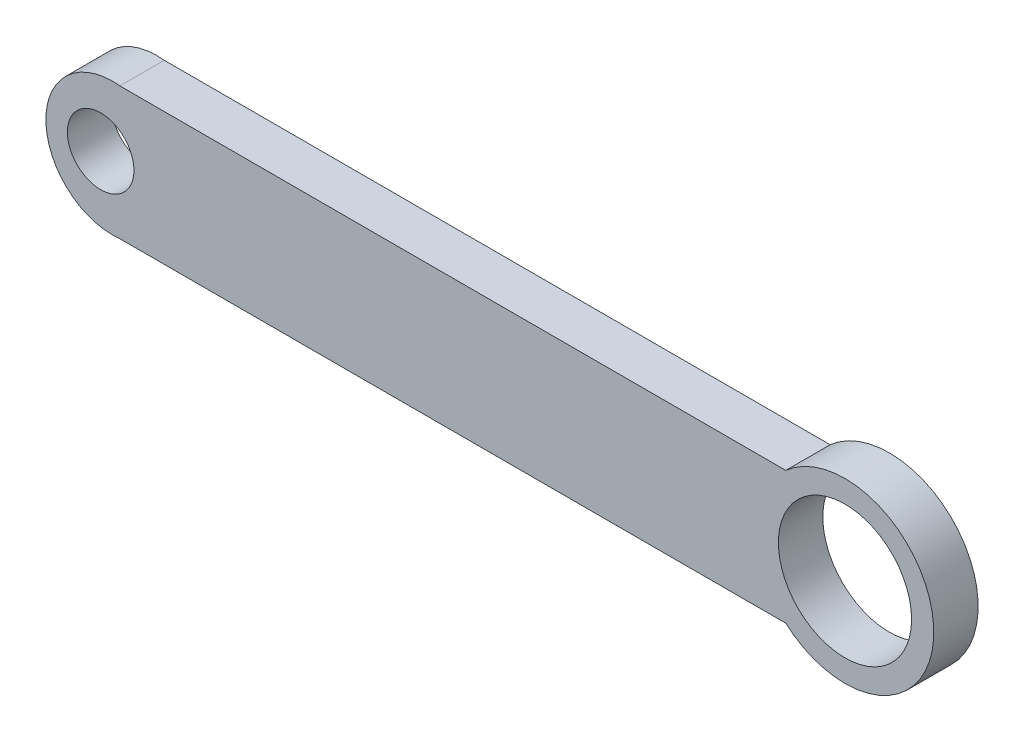
ISO-10303-21;
HEADER;
FILE_DESCRIPTION(('STEP AP214'),'2;1');
FILE_NAME('part.step','',(''),(''),'','','');
FILE_SCHEMA(('AUTOMOTIVE_DESIGN { 1 0 10303 214 1 1 1 1 }'));
ENDSEC;
DATA;
#1=APPLICATION_CONTEXT('core data for automotive mechanical design processes');
#2=APPLICATION_PROTOCOL_DEFINITION('international standard','automotive_design',2000,#1);
#3=PRODUCT_CONTEXT('',#1,'mechanical');
#4=PRODUCT('Part','Part','',(#3));
#5=PRODUCT_RELATED_PRODUCT_CATEGORY('part','',(#4));
#6=PRODUCT_DEFINITION_FORMATION('','',#4);
#7=PRODUCT_DEFINITION_CONTEXT('part definition',#1,'design');
#8=PRODUCT_DEFINITION('design','',#6,#7);
#9=PRODUCT_DEFINITION_SHAPE('','',#8);
#10=(LENGTH_UNIT() NAMED_UNIT(*) SI_UNIT(.MILLI.,.METRE.));
#11=(NAMED_UNIT(*) PLANE_ANGLE_UNIT() SI_UNIT($,.RADIAN.));
#12=(NAMED_UNIT(*) SI_UNIT($,.STERADIAN.) SOLID_ANGLE_UNIT());
#13=UNCERTAINTY_MEASURE_WITH_UNIT(LENGTH_MEASURE(1.E-05),#10,'distance_accuracy_value','');
#14=(GEOMETRIC_REPRESENTATION_CONTEXT(3) GLOBAL_UNCERTAINTY_ASSIGNED_CONTEXT((#13)) GLOBAL_UNIT_ASSIGNED_CONTEXT((#10,
#11,#12)) REPRESENTATION_CONTEXT('',''));
#15=CARTESIAN_POINT('',(0.,0.,0.));
#16=DIRECTION('',(0.,0.,1.));
#17=DIRECTION('',(1.,0.,0.));
#18=AXIS2_PLACEMENT_3D('',#15,#16,#17);
#19=CARTESIAN_POINT('',(20.,0.,2.));
#20=DIRECTION('',(0.,0.,-1.));
#21=DIRECTION('',(1.,0.,0.));
#22=AXIS2_PLACEMENT_3D('',#19,#20,#21);
#23=CYLINDRICAL_SURFACE('',#22,3.);
#24=DIRECTION('',(0.,0.,-1.));
#25=VECTOR('',#24,1.);
#26=CARTESIAN_POINT('',(23.,0.,2.));
#27=LINE('',#26,#25);
#28=CARTESIAN_POINT('',(23.,0.,2.));
#29=VERTEX_POINT('',#28);
#30=CARTESIAN_POINT('',(23.,0.,0.));
#31=VERTEX_POINT('',#30);
#32=EDGE_CURVE('E9',#29,#31,#27,.T.);
#33=ORIENTED_EDGE('',*,*,#32,.F.);
#34=CARTESIAN_POINT('',(20.,0.,2.));
#35=DIRECTION('',(0.,0.,1.));
#36=DIRECTION('',(1.,0.,0.));
#37=AXIS2_PLACEMENT_3D('',#34,#35,#36);
#38=CIRCLE('',#37,3.);
#39=EDGE_CURVE('E119',#29,#29,#38,.T.);
#40=ORIENTED_EDGE('',*,*,#39,.T.);
#41=ORIENTED_EDGE('',*,*,#32,.T.);
#42=CARTESIAN_POINT('',(20.,0.,0.));
#43=DIRECTION('',(0.,0.,-1.));
#44=DIRECTION('',(1.,0.,0.));
#45=AXIS2_PLACEMENT_3D('',#42,#43,#44);
#46=CIRCLE('',#45,3.);
#47=EDGE_CURVE('E112',#31,#31,#46,.T.);
#48=ORIENTED_EDGE('',*,*,#47,.T.);
#49=EDGE_LOOP('',(#33,#40,#41,#48));
#50=FACE_BOUND('',#49,.T.);
#51=ADVANCED_FACE('F14',(#50),#23,.F.);
#52=CARTESIAN_POINT('',(-13.53189,0.,2.));
#53=DIRECTION('',(0.,0.,-1.));
#54=DIRECTION('',(1.,0.,0.));
#55=AXIS2_PLACEMENT_3D('',#52,#53,#54);
#56=CYLINDRICAL_SURFACE('',#55,1.5);
#57=DIRECTION('',(0.,0.,-1.));
#58=VECTOR('',#57,1.);
#59=CARTESIAN_POINT('',(-12.03189,0.,2.));
#60=LINE('',#59,#58);
#61=CARTESIAN_POINT('',(-12.03189,0.,2.));
#62=VERTEX_POINT('',#61);
#63=CARTESIAN_POINT('',(-12.03189,0.,0.));
#64=VERTEX_POINT('',#63);
#65=EDGE_CURVE('E25',#62,#64,#60,.T.);
#66=ORIENTED_EDGE('',*,*,#65,.F.);
#67=CARTESIAN_POINT('',(-13.53189,0.,2.));
#68=DIRECTION('',(0.,0.,1.));
#69=DIRECTION('',(1.,0.,0.));
#70=AXIS2_PLACEMENT_3D('',#67,#68,#69);
#71=CIRCLE('',#70,1.5);
#72=EDGE_CURVE('E116',#62,#62,#71,.T.);
#73=ORIENTED_EDGE('',*,*,#72,.T.);
#74=ORIENTED_EDGE('',*,*,#65,.T.);
#75=CARTESIAN_POINT('',(-13.53189,0.,0.));
#76=DIRECTION('',(0.,0.,-1.));
#77=DIRECTION('',(1.,0.,0.));
#78=AXIS2_PLACEMENT_3D('',#75,#76,#77);
#79=CIRCLE('',#78,1.5);
#80=EDGE_CURVE('E108',#64,#64,#79,.T.);
#81=ORIENTED_EDGE('',*,*,#80,.T.);
#82=EDGE_LOOP('',(#66,#73,#74,#81));
#83=FACE_BOUND('',#82,.T.);
#84=ADVANCED_FACE('F166',(#83),#56,.F.);
#85=CARTESIAN_POINT('',(-13.,0.,0.));
#86=DIRECTION('',(0.,0.,-1.));
#87=DIRECTION('',(1.,0.,0.));
#88=AXIS2_PLACEMENT_3D('',#85,#86,#87);
#89=CYLINDRICAL_SURFACE('',#88,3.);
#90=CARTESIAN_POINT('',(-13.,0.,0.));
#91=DIRECTION('',(0.,0.,1.));
#92=DIRECTION('',(1.,0.,0.));
#93=AXIS2_PLACEMENT_3D('',#90,#91,#92);
#94=CIRCLE('',#93,3.);
#95=CARTESIAN_POINT('',(-12.66666666666,2.98142397,0.));
#96=VERTEX_POINT('',#95);
#97=CARTESIAN_POINT('',(-12.66666666666,-2.98142397,0.));
#98=VERTEX_POINT('',#97);
#99=EDGE_CURVE('E106',#96,#98,#94,.T.);
#100=ORIENTED_EDGE('',*,*,#99,.T.);
#101=DIRECTION('',(0.,0.,1.));
#102=VECTOR('',#101,1.);
#103=CARTESIAN_POINT('',(-12.66666666666,-2.98142397,0.));
#104=LINE('',#103,#102);
#105=CARTESIAN_POINT('',(-12.66666666666,-2.98142397,2.));
#106=VERTEX_POINT('',#105);
#107=EDGE_CURVE('E83',#98,#106,#104,.T.);
#108=ORIENTED_EDGE('',*,*,#107,.T.);
#109=CARTESIAN_POINT('',(-13.,0.,2.));
#110=DIRECTION('',(0.,0.,1.));
#111=DIRECTION('',(1.,0.,0.));
#112=AXIS2_PLACEMENT_3D('',#109,#110,#111);
#113=CIRCLE('',#112,3.);
#114=CARTESIAN_POINT('',(-12.66666666666,2.98142397,2.));
#115=VERTEX_POINT('',#114);
#116=EDGE_CURVE('E113',#115,#106,#113,.T.);
#117=ORIENTED_EDGE('',*,*,#116,.F.);
#118=DIRECTION('',(0.,0.,1.));
#119=VECTOR('',#118,1.);
#120=CARTESIAN_POINT('',(-12.66666666666,2.98142397,0.));
#121=LINE('',#120,#119);
#122=EDGE_CURVE('E124',#96,#115,#121,.T.);
#123=ORIENTED_EDGE('',*,*,#122,.F.);
#124=EDGE_LOOP('',(#100,#108,#117,#123));
#125=FACE_BOUND('',#124,.T.);
#126=ADVANCED_FACE('F148',(#125),#89,.T.);
#127=CARTESIAN_POINT('',(4.066596987969,0.,2.));
#128=DIRECTION('',(0.,0.,1.));
#129=DIRECTION('',(1.,0.,0.));
#130=AXIS2_PLACEMENT_3D('',#127,#128,#129);
#131=PLANE('',#130);
#132=ORIENTED_EDGE('',*,*,#39,.F.);
#133=EDGE_LOOP('',(#132));
#134=FACE_BOUND('',#133,.T.);
#135=ORIENTED_EDGE('',*,*,#72,.F.);
#136=EDGE_LOOP('',(#135));
#137=FACE_BOUND('',#136,.T.);
#138=CARTESIAN_POINT('',(20.,0.,2.));
#139=DIRECTION('',(0.,0.,1.));
#140=DIRECTION('',(1.,0.,0.));
#141=AXIS2_PLACEMENT_3D('',#138,#139,#140);
#142=CIRCLE('',#141,4.);
#143=CARTESIAN_POINT('',(17.333333333333,-2.98142397,2.));
#144=VERTEX_POINT('',#143);
#145=CARTESIAN_POINT('',(17.333333333333,2.98142397,2.));
#146=VERTEX_POINT('',#145);
#147=EDGE_CURVE('E92',#144,#146,#142,.T.);
#148=ORIENTED_EDGE('',*,*,#147,.T.);
#149=DIRECTION('',(1.,0.,0.));
#150=VECTOR('',#149,1.);
#151=CARTESIAN_POINT('',(-12.66666666666,2.98142397,2.));
#152=LINE('',#151,#150);
#153=EDGE_CURVE('E121',#115,#146,#152,.T.);
#154=ORIENTED_EDGE('',*,*,#153,.F.);
#155=ORIENTED_EDGE('',*,*,#116,.T.);
#156=DIRECTION('',(1.,0.,0.));
#157=VECTOR('',#156,1.);
#158=CARTESIAN_POINT('',(-12.66666666666,-2.98142397,2.));
#159=LINE('',#158,#157);
#160=EDGE_CURVE('E18',#106,#144,#159,.T.);
#161=ORIENTED_EDGE('',*,*,#160,.T.);
#162=EDGE_LOOP('',(#148,#154,#155,#161));
#163=FACE_BOUND('',#162,.T.);
#164=ADVANCED_FACE('F141',(#134,#137,#163),#131,.T.);
#165=CARTESIAN_POINT('',(4.066596987969,0.,0.));
#166=DIRECTION('',(0.,0.,1.));
#167=DIRECTION('',(1.,0.,0.));
#168=AXIS2_PLACEMENT_3D('',#165,#166,#167);
#169=PLANE('',#168);
#170=ORIENTED_EDGE('',*,*,#47,.F.);
#171=EDGE_LOOP('',(#170));
#172=FACE_BOUND('',#171,.T.);
#173=ORIENTED_EDGE('',*,*,#80,.F.);
#174=EDGE_LOOP('',(#173));
#175=FACE_BOUND('',#174,.T.);
#176=DIRECTION('',(1.,0.,0.));
#177=VECTOR('',#176,1.);
#178=CARTESIAN_POINT('',(-12.66666666666,-2.98142397,0.));
#179=LINE('',#178,#177);
#180=CARTESIAN_POINT('',(17.333333333333,-2.98142397,0.));
#181=VERTEX_POINT('',#180);
#182=EDGE_CURVE('E76',#98,#181,#179,.T.);
#183=ORIENTED_EDGE('',*,*,#182,.F.);
#184=ORIENTED_EDGE('',*,*,#99,.F.);
#185=DIRECTION('',(1.,0.,0.));
#186=VECTOR('',#185,1.);
#187=CARTESIAN_POINT('',(-12.66666666666,2.98142397,0.));
#188=LINE('',#187,#186);
#189=CARTESIAN_POINT('',(17.333333333333,2.98142397,0.));
#190=VERTEX_POINT('',#189);
#191=EDGE_CURVE('E67',#96,#190,#188,.T.);
#192=ORIENTED_EDGE('',*,*,#191,.T.);
#193=CARTESIAN_POINT('',(20.,0.,0.));
#194=DIRECTION('',(0.,0.,1.));
#195=DIRECTION('',(1.,0.,0.));
#196=AXIS2_PLACEMENT_3D('',#193,#194,#195);
#197=CIRCLE('',#196,4.);
#198=EDGE_CURVE('E90',#181,#190,#197,.T.);
#199=ORIENTED_EDGE('',*,*,#198,.F.);
#200=EDGE_LOOP('',(#183,#184,#192,#199));
#201=FACE_BOUND('',#200,.T.);
#202=ADVANCED_FACE('F95',(#172,#175,#201),#169,.F.);
#203=CARTESIAN_POINT('',(-12.66666666666,2.98142397,0.));
#204=DIRECTION('',(0.,1.,0.));
#205=DIRECTION('',(1.,0.,0.));
#206=AXIS2_PLACEMENT_3D('',#203,#204,#205);
#207=PLANE('',#206);
#208=ORIENTED_EDGE('',*,*,#122,.T.);
#209=ORIENTED_EDGE('',*,*,#153,.T.);
#210=DIRECTION('',(0.,0.,1.));
#211=VECTOR('',#210,1.);
#212=CARTESIAN_POINT('',(17.333333333333,2.98142397,0.));
#213=LINE('',#212,#211);
#214=EDGE_CURVE('E97',#190,#146,#213,.T.);
#215=ORIENTED_EDGE('',*,*,#214,.F.);
#216=ORIENTED_EDGE('',*,*,#191,.F.);
#217=EDGE_LOOP('',(#208,#209,#215,#216));
#218=FACE_BOUND('',#217,.T.);
#219=ADVANCED_FACE('F16',(#218),#207,.T.);
#220=CARTESIAN_POINT('',(-12.66666666666,-2.98142397,0.));
#221=DIRECTION('',(0.,1.,0.));
#222=DIRECTION('',(1.,0.,0.));
#223=AXIS2_PLACEMENT_3D('',#220,#221,#222);
#224=PLANE('',#223);
#225=ORIENTED_EDGE('',*,*,#182,.T.);
#226=DIRECTION('',(0.,0.,1.));
#227=VECTOR('',#226,1.);
#228=CARTESIAN_POINT('',(17.333333333333,-2.98142397,0.));
#229=LINE('',#228,#227);
#230=EDGE_CURVE('E80',#181,#144,#229,.T.);
#231=ORIENTED_EDGE('',*,*,#230,.T.);
#232=ORIENTED_EDGE('',*,*,#160,.F.);
#233=ORIENTED_EDGE('',*,*,#107,.F.);
#234=EDGE_LOOP('',(#225,#231,#232,#233));
#235=FACE_BOUND('',#234,.T.);
#236=ADVANCED_FACE('F78',(#235),#224,.F.);
#237=CARTESIAN_POINT('',(20.,0.,0.));
#238=DIRECTION('',(0.,0.,-1.));
#239=DIRECTION('',(1.,0.,0.));
#240=AXIS2_PLACEMENT_3D('',#237,#238,#239);
#241=CYLINDRICAL_SURFACE('',#240,4.);
#242=ORIENTED_EDGE('',*,*,#198,.T.);
#243=ORIENTED_EDGE('',*,*,#214,.T.);
#244=ORIENTED_EDGE('',*,*,#147,.F.);
#245=ORIENTED_EDGE('',*,*,#230,.F.);
#246=EDGE_LOOP('',(#242,#243,#244,#245));
#247=FACE_BOUND('',#246,.T.);
#248=ADVANCED_FACE('F88',(#247),#241,.T.);
#249=CLOSED_SHELL('',(#51,#84,#126,#164,#202,#219,#236,#248));
#250=MANIFOLD_SOLID_BREP('B1',#249);
#251=ADVANCED_BREP_SHAPE_REPRESENTATION('',(#18,#250),#14);
#252=SHAPE_DEFINITION_REPRESENTATION(#9,#251);
ENDSEC;
END-ISO-10303-21;
